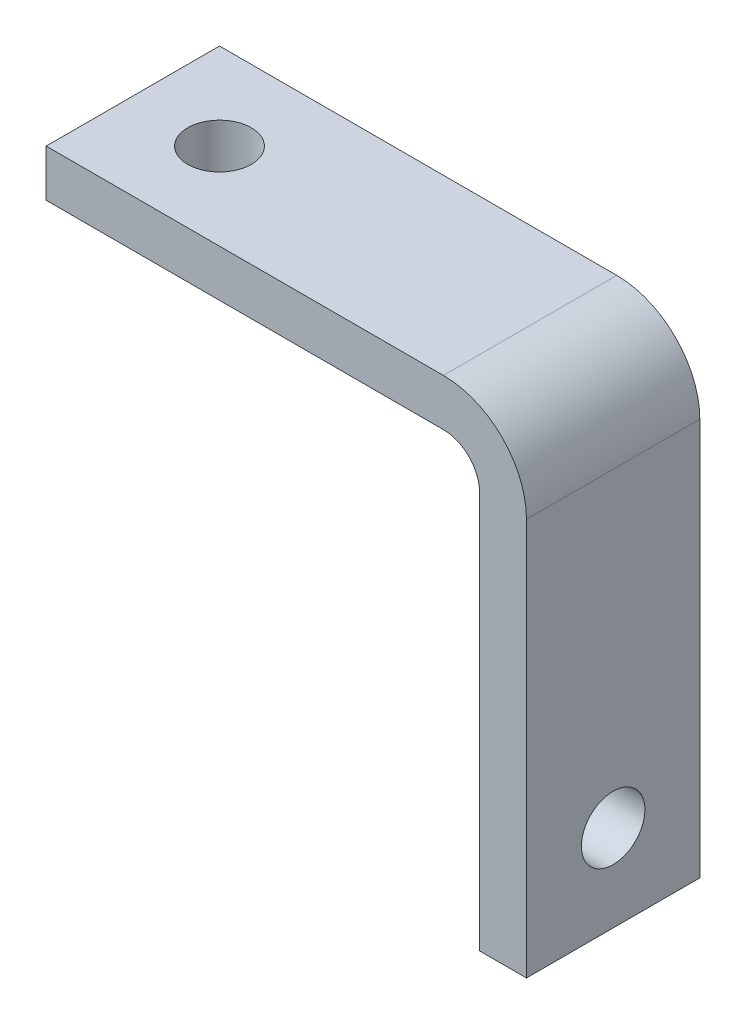
ISO-10303-21;
HEADER;
FILE_DESCRIPTION(('STEP AP214'),'2;1');
FILE_NAME('part.step','',(''),(''),'','','');
FILE_SCHEMA(('AUTOMOTIVE_DESIGN { 1 0 10303 214 1 1 1 1 }'));
ENDSEC;
DATA;
#1=APPLICATION_CONTEXT('core data for automotive mechanical design processes');
#2=APPLICATION_PROTOCOL_DEFINITION('international standard','automotive_design',2000,#1);
#3=PRODUCT_CONTEXT('',#1,'mechanical');
#4=PRODUCT('Part','Part','',(#3));
#5=PRODUCT_RELATED_PRODUCT_CATEGORY('part','',(#4));
#6=PRODUCT_DEFINITION_FORMATION('','',#4);
#7=PRODUCT_DEFINITION_CONTEXT('part definition',#1,'design');
#8=PRODUCT_DEFINITION('design','',#6,#7);
#9=PRODUCT_DEFINITION_SHAPE('','',#8);
#10=(LENGTH_UNIT() NAMED_UNIT(*) SI_UNIT(.MILLI.,.METRE.));
#11=(NAMED_UNIT(*) PLANE_ANGLE_UNIT() SI_UNIT($,.RADIAN.));
#12=(NAMED_UNIT(*) SI_UNIT($,.STERADIAN.) SOLID_ANGLE_UNIT());
#13=UNCERTAINTY_MEASURE_WITH_UNIT(LENGTH_MEASURE(1.E-05),#10,'distance_accuracy_value','');
#14=(GEOMETRIC_REPRESENTATION_CONTEXT(3) GLOBAL_UNCERTAINTY_ASSIGNED_CONTEXT((#13)) GLOBAL_UNIT_ASSIGNED_CONTEXT((#10,
#11,#12)) REPRESENTATION_CONTEXT('',''));
#15=CARTESIAN_POINT('',(0.,0.,0.));
#16=DIRECTION('',(0.,0.,1.));
#17=DIRECTION('',(1.,0.,0.));
#18=AXIS2_PLACEMENT_3D('',#15,#16,#17);
#19=CARTESIAN_POINT('',(0.,0.,0.));
#20=DIRECTION('',(0.,1.,0.));
#21=DIRECTION('',(0.,0.,1.));
#22=AXIS2_PLACEMENT_3D('',#19,#20,#21);
#23=PLANE('',#22);
#24=CARTESIAN_POINT('',(-27.25,0.,-6.));
#25=DIRECTION('',(0.,1.,0.));
#26=DIRECTION('',(0.,0.,1.));
#27=AXIS2_PLACEMENT_3D('',#24,#25,#26);
#28=CIRCLE('',#27,2.2);
#29=CARTESIAN_POINT('',(-27.25,0.,-3.8));
#30=VERTEX_POINT('',#29);
#31=EDGE_CURVE('E145',#30,#30,#28,.T.);
#32=ORIENTED_EDGE('',*,*,#31,.T.);
#33=EDGE_LOOP('',(#32));
#34=FACE_BOUND('',#33,.T.);
#35=DIRECTION('',(-1.,0.,0.));
#36=VECTOR('',#35,1.);
#37=CARTESIAN_POINT('',(0.,0.,-12.));
#38=LINE('',#37,#36);
#39=CARTESIAN_POINT('',(-5.75,0.,-12.));
#40=VERTEX_POINT('',#39);
#41=CARTESIAN_POINT('',(-33.25,0.,-12.));
#42=VERTEX_POINT('',#41);
#43=EDGE_CURVE('E143',#40,#42,#38,.T.);
#44=ORIENTED_EDGE('',*,*,#43,.F.);
#45=DIRECTION('',(0.,0.,-1.));
#46=VECTOR('',#45,1.);
#47=CARTESIAN_POINT('',(-5.75,0.,0.));
#48=LINE('',#47,#46);
#49=CARTESIAN_POINT('',(-5.75,0.,0.));
#50=VERTEX_POINT('',#49);
#51=EDGE_CURVE('E58',#40,#50,#48,.F.);
#52=ORIENTED_EDGE('',*,*,#51,.T.);
#53=DIRECTION('',(1.,0.,0.));
#54=VECTOR('',#53,1.);
#55=CARTESIAN_POINT('',(0.,0.,0.));
#56=LINE('',#55,#54);
#57=CARTESIAN_POINT('',(-33.25,0.,0.));
#58=VERTEX_POINT('',#57);
#59=EDGE_CURVE('E212',#58,#50,#56,.T.);
#60=ORIENTED_EDGE('',*,*,#59,.F.);
#61=DIRECTION('',(0.,0.,1.));
#62=VECTOR('',#61,1.);
#63=CARTESIAN_POINT('',(-33.25,0.,0.));
#64=LINE('',#63,#62);
#65=EDGE_CURVE('E214',#42,#58,#64,.T.);
#66=ORIENTED_EDGE('',*,*,#65,.F.);
#67=EDGE_LOOP('',(#44,#52,#60,#66));
#68=FACE_BOUND('',#67,.T.);
#69=ADVANCED_FACE('F39',(#34,#68),#23,.F.);
#70=CARTESIAN_POINT('',(0.,3.25,0.));
#71=DIRECTION('',(-1.,0.,0.));
#72=DIRECTION('',(0.,0.,1.));
#73=AXIS2_PLACEMENT_3D('',#70,#71,#72);
#74=PLANE('',#73);
#75=CARTESIAN_POINT('',(0.,-24.,-6.));
#76=DIRECTION('',(1.,0.,0.));
#77=DIRECTION('',(0.,0.,-1.));
#78=AXIS2_PLACEMENT_3D('',#75,#76,#77);
#79=CIRCLE('',#78,2.2);
#80=CARTESIAN_POINT('',(0.,-24.,-8.2));
#81=VERTEX_POINT('',#80);
#82=EDGE_CURVE('E135',#81,#81,#79,.T.);
#83=ORIENTED_EDGE('',*,*,#82,.F.);
#84=EDGE_LOOP('',(#83));
#85=FACE_BOUND('',#84,.T.);
#86=DIRECTION('',(0.,-1.,0.));
#87=VECTOR('',#86,1.);
#88=CARTESIAN_POINT('',(0.,3.25,-12.));
#89=LINE('',#88,#87);
#90=CARTESIAN_POINT('',(0.,-2.5,-12.));
#91=VERTEX_POINT('',#90);
#92=CARTESIAN_POINT('',(0.,-30.,-12.));
#93=VERTEX_POINT('',#92);
#94=EDGE_CURVE('E188',#91,#93,#89,.T.);
#95=ORIENTED_EDGE('',*,*,#94,.F.);
#96=DIRECTION('',(0.,0.,-1.));
#97=VECTOR('',#96,1.);
#98=CARTESIAN_POINT('',(0.,-2.5,0.));
#99=LINE('',#98,#97);
#100=CARTESIAN_POINT('',(0.,-2.5,0.));
#101=VERTEX_POINT('',#100);
#102=EDGE_CURVE('E109',#91,#101,#99,.F.);
#103=ORIENTED_EDGE('',*,*,#102,.T.);
#104=DIRECTION('',(0.,-1.,0.));
#105=VECTOR('',#104,1.);
#106=CARTESIAN_POINT('',(0.,3.25,0.));
#107=LINE('',#106,#105);
#108=CARTESIAN_POINT('',(0.,-30.,0.));
#109=VERTEX_POINT('',#108);
#110=EDGE_CURVE('E101',#101,#109,#107,.T.);
#111=ORIENTED_EDGE('',*,*,#110,.T.);
#112=DIRECTION('',(0.,0.,1.));
#113=VECTOR('',#112,1.);
#114=CARTESIAN_POINT('',(0.,-30.,0.));
#115=LINE('',#114,#113);
#116=EDGE_CURVE('E108',#93,#109,#115,.T.);
#117=ORIENTED_EDGE('',*,*,#116,.F.);
#118=EDGE_LOOP('',(#95,#103,#111,#117));
#119=FACE_BOUND('',#118,.T.);
#120=ADVANCED_FACE('F106',(#85,#119),#74,.F.);
#121=CARTESIAN_POINT('',(0.,3.25,-12.));
#122=DIRECTION('',(0.,0.,1.));
#123=DIRECTION('',(1.,0.,0.));
#124=AXIS2_PLACEMENT_3D('',#121,#122,#123);
#125=PLANE('',#124);
#126=DIRECTION('',(-1.,0.,0.));
#127=VECTOR('',#126,1.);
#128=CARTESIAN_POINT('',(0.,3.25,-12.));
#129=LINE('',#128,#127);
#130=CARTESIAN_POINT('',(-5.75,3.25,-12.));
#131=VERTEX_POINT('',#130);
#132=CARTESIAN_POINT('',(-33.25,3.25,-12.));
#133=VERTEX_POINT('',#132);
#134=EDGE_CURVE('E153',#131,#133,#129,.T.);
#135=ORIENTED_EDGE('',*,*,#134,.F.);
#136=CARTESIAN_POINT('',(-5.75,-2.5,-12.));
#137=DIRECTION('',(0.,0.,1.));
#138=DIRECTION('',(1.,0.,0.));
#139=AXIS2_PLACEMENT_3D('',#136,#137,#138);
#140=CIRCLE('',#139,5.75);
#141=EDGE_CURVE('E186',#131,#91,#140,.F.);
#142=ORIENTED_EDGE('',*,*,#141,.T.);
#143=ORIENTED_EDGE('',*,*,#94,.T.);
#144=DIRECTION('',(1.,0.,0.));
#145=VECTOR('',#144,1.);
#146=CARTESIAN_POINT('',(0.,-30.,-12.));
#147=LINE('',#146,#145);
#148=CARTESIAN_POINT('',(-3.25,-30.,-12.));
#149=VERTEX_POINT('',#148);
#150=EDGE_CURVE('E129',#149,#93,#147,.T.);
#151=ORIENTED_EDGE('',*,*,#150,.F.);
#152=DIRECTION('',(0.,1.,0.));
#153=VECTOR('',#152,1.);
#154=CARTESIAN_POINT('',(-3.25,-30.,-12.));
#155=LINE('',#154,#153);
#156=CARTESIAN_POINT('',(-3.25,-2.5,-12.));
#157=VERTEX_POINT('',#156);
#158=EDGE_CURVE('E139',#149,#157,#155,.T.);
#159=ORIENTED_EDGE('',*,*,#158,.T.);
#160=CARTESIAN_POINT('',(-5.75,-2.5,-12.));
#161=DIRECTION('',(0.,0.,1.));
#162=DIRECTION('',(1.,0.,0.));
#163=AXIS2_PLACEMENT_3D('',#160,#161,#162);
#164=CIRCLE('',#163,2.5);
#165=EDGE_CURVE('E50',#157,#40,#164,.T.);
#166=ORIENTED_EDGE('',*,*,#165,.T.);
#167=ORIENTED_EDGE('',*,*,#43,.T.);
#168=DIRECTION('',(0.,-1.,0.));
#169=VECTOR('',#168,1.);
#170=CARTESIAN_POINT('',(-33.25,3.25,-12.));
#171=LINE('',#170,#169);
#172=EDGE_CURVE('E203',#133,#42,#171,.T.);
#173=ORIENTED_EDGE('',*,*,#172,.F.);
#174=EDGE_LOOP('',(#135,#142,#143,#151,#159,#166,#167,#173));
#175=FACE_BOUND('',#174,.T.);
#176=ADVANCED_FACE('F201',(#175),#125,.F.);
#177=CARTESIAN_POINT('',(-33.25,3.25,0.));
#178=DIRECTION('',(1.,0.,0.));
#179=DIRECTION('',(0.,0.,-1.));
#180=AXIS2_PLACEMENT_3D('',#177,#178,#179);
#181=PLANE('',#180);
#182=ORIENTED_EDGE('',*,*,#65,.T.);
#183=DIRECTION('',(0.,-1.,0.));
#184=VECTOR('',#183,1.);
#185=CARTESIAN_POINT('',(-33.25,3.25,0.));
#186=LINE('',#185,#184);
#187=CARTESIAN_POINT('',(-33.25,3.25,0.));
#188=VERTEX_POINT('',#187);
#189=EDGE_CURVE('E113',#188,#58,#186,.T.);
#190=ORIENTED_EDGE('',*,*,#189,.F.);
#191=DIRECTION('',(0.,0.,1.));
#192=VECTOR('',#191,1.);
#193=CARTESIAN_POINT('',(-33.25,3.25,0.));
#194=LINE('',#193,#192);
#195=EDGE_CURVE('E220',#133,#188,#194,.T.);
#196=ORIENTED_EDGE('',*,*,#195,.F.);
#197=ORIENTED_EDGE('',*,*,#172,.T.);
#198=EDGE_LOOP('',(#182,#190,#196,#197));
#199=FACE_BOUND('',#198,.T.);
#200=ADVANCED_FACE('F223',(#199),#181,.F.);
#201=CARTESIAN_POINT('',(0.,3.25,0.));
#202=DIRECTION('',(0.,0.,-1.));
#203=DIRECTION('',(-1.,0.,0.));
#204=AXIS2_PLACEMENT_3D('',#201,#202,#203);
#205=PLANE('',#204);
#206=ORIENTED_EDGE('',*,*,#110,.F.);
#207=CARTESIAN_POINT('',(-5.75,-2.5,0.));
#208=DIRECTION('',(0.,0.,-1.));
#209=DIRECTION('',(-1.,0.,0.));
#210=AXIS2_PLACEMENT_3D('',#207,#208,#209);
#211=CIRCLE('',#210,5.75);
#212=CARTESIAN_POINT('',(-5.75,3.25,0.));
#213=VERTEX_POINT('',#212);
#214=EDGE_CURVE('E194',#101,#213,#211,.F.);
#215=ORIENTED_EDGE('',*,*,#214,.T.);
#216=DIRECTION('',(1.,0.,0.));
#217=VECTOR('',#216,1.);
#218=CARTESIAN_POINT('',(0.,3.25,0.));
#219=LINE('',#218,#217);
#220=EDGE_CURVE('E112',#188,#213,#219,.T.);
#221=ORIENTED_EDGE('',*,*,#220,.F.);
#222=ORIENTED_EDGE('',*,*,#189,.T.);
#223=ORIENTED_EDGE('',*,*,#59,.T.);
#224=CARTESIAN_POINT('',(-5.75,-2.5,0.));
#225=DIRECTION('',(0.,0.,-1.));
#226=DIRECTION('',(-1.,0.,0.));
#227=AXIS2_PLACEMENT_3D('',#224,#225,#226);
#228=CIRCLE('',#227,2.5);
#229=CARTESIAN_POINT('',(-3.25,-2.5,0.));
#230=VERTEX_POINT('',#229);
#231=EDGE_CURVE('E11',#50,#230,#228,.T.);
#232=ORIENTED_EDGE('',*,*,#231,.T.);
#233=DIRECTION('',(0.,1.,0.));
#234=VECTOR('',#233,1.);
#235=CARTESIAN_POINT('',(-3.25,-30.,0.));
#236=LINE('',#235,#234);
#237=CARTESIAN_POINT('',(-3.25,-30.,0.));
#238=VERTEX_POINT('',#237);
#239=EDGE_CURVE('E119',#238,#230,#236,.T.);
#240=ORIENTED_EDGE('',*,*,#239,.F.);
#241=DIRECTION('',(-1.,0.,0.));
#242=VECTOR('',#241,1.);
#243=CARTESIAN_POINT('',(0.,-30.,0.));
#244=LINE('',#243,#242);
#245=EDGE_CURVE('E120',#109,#238,#244,.T.);
#246=ORIENTED_EDGE('',*,*,#245,.F.);
#247=EDGE_LOOP('',(#206,#215,#221,#222,#223,#232,#240,#246));
#248=FACE_BOUND('',#247,.T.);
#249=ADVANCED_FACE('F117',(#248),#205,.F.);
#250=CARTESIAN_POINT('',(0.,3.25,0.));
#251=DIRECTION('',(0.,1.,0.));
#252=DIRECTION('',(0.,0.,1.));
#253=AXIS2_PLACEMENT_3D('',#250,#251,#252);
#254=PLANE('',#253);
#255=CARTESIAN_POINT('',(-27.25,3.250012,-6.));
#256=DIRECTION('',(0.,1.,0.));
#257=DIRECTION('',(0.,0.,1.));
#258=AXIS2_PLACEMENT_3D('',#255,#256,#257);
#259=CIRCLE('',#258,2.2);
#260=CARTESIAN_POINT('',(-27.25,3.250012,-3.8));
#261=VERTEX_POINT('',#260);
#262=EDGE_CURVE('E142',#261,#261,#259,.T.);
#263=ORIENTED_EDGE('',*,*,#262,.F.);
#264=EDGE_LOOP('',(#263));
#265=FACE_BOUND('',#264,.T.);
#266=ORIENTED_EDGE('',*,*,#220,.T.);
#267=DIRECTION('',(0.,0.,-1.));
#268=VECTOR('',#267,1.);
#269=CARTESIAN_POINT('',(-5.75,3.25,-12.));
#270=LINE('',#269,#268);
#271=EDGE_CURVE('E187',#213,#131,#270,.T.);
#272=ORIENTED_EDGE('',*,*,#271,.T.);
#273=ORIENTED_EDGE('',*,*,#134,.T.);
#274=ORIENTED_EDGE('',*,*,#195,.T.);
#275=EDGE_LOOP('',(#266,#272,#273,#274));
#276=FACE_BOUND('',#275,.T.);
#277=ADVANCED_FACE('F170',(#265,#276),#254,.T.);
#278=CARTESIAN_POINT('',(-27.25,0.,-6.));
#279=DIRECTION('',(0.,1.,0.));
#280=DIRECTION('',(0.,0.,1.));
#281=AXIS2_PLACEMENT_3D('',#278,#279,#280);
#282=CYLINDRICAL_SURFACE('',#281,2.2);
#283=ORIENTED_EDGE('',*,*,#31,.F.);
#284=EDGE_LOOP('',(#283));
#285=FACE_BOUND('',#284,.T.);
#286=ORIENTED_EDGE('',*,*,#262,.T.);
#287=EDGE_LOOP('',(#286));
#288=FACE_BOUND('',#287,.T.);
#289=ADVANCED_FACE('F157',(#285,#288),#282,.F.);
#290=CARTESIAN_POINT('',(-3.25,-30.,0.));
#291=DIRECTION('',(1.,0.,0.));
#292=DIRECTION('',(0.,0.,-1.));
#293=AXIS2_PLACEMENT_3D('',#290,#291,#292);
#294=PLANE('',#293);
#295=CARTESIAN_POINT('',(-3.25,-24.,-6.));
#296=DIRECTION('',(1.,0.,0.));
#297=DIRECTION('',(0.,0.,-1.));
#298=AXIS2_PLACEMENT_3D('',#295,#296,#297);
#299=CIRCLE('',#298,2.2);
#300=CARTESIAN_POINT('',(-3.25,-24.,-8.2));
#301=VERTEX_POINT('',#300);
#302=EDGE_CURVE('E126',#301,#301,#299,.T.);
#303=ORIENTED_EDGE('',*,*,#302,.T.);
#304=EDGE_LOOP('',(#303));
#305=FACE_BOUND('',#304,.T.);
#306=ORIENTED_EDGE('',*,*,#239,.T.);
#307=DIRECTION('',(0.,0.,-1.));
#308=VECTOR('',#307,1.);
#309=CARTESIAN_POINT('',(-3.25,-2.5,-12.));
#310=LINE('',#309,#308);
#311=EDGE_CURVE('E193',#230,#157,#310,.T.);
#312=ORIENTED_EDGE('',*,*,#311,.T.);
#313=ORIENTED_EDGE('',*,*,#158,.F.);
#314=DIRECTION('',(0.,0.,-1.));
#315=VECTOR('',#314,1.);
#316=CARTESIAN_POINT('',(-3.25,-30.,0.));
#317=LINE('',#316,#315);
#318=EDGE_CURVE('E124',#238,#149,#317,.T.);
#319=ORIENTED_EDGE('',*,*,#318,.F.);
#320=EDGE_LOOP('',(#306,#312,#313,#319));
#321=FACE_BOUND('',#320,.T.);
#322=ADVANCED_FACE('F168',(#305,#321),#294,.F.);
#323=CARTESIAN_POINT('',(0.,-30.,0.));
#324=DIRECTION('',(0.,1.,0.));
#325=DIRECTION('',(0.,0.,1.));
#326=AXIS2_PLACEMENT_3D('',#323,#324,#325);
#327=PLANE('',#326);
#328=ORIENTED_EDGE('',*,*,#116,.T.);
#329=ORIENTED_EDGE('',*,*,#245,.T.);
#330=ORIENTED_EDGE('',*,*,#318,.T.);
#331=ORIENTED_EDGE('',*,*,#150,.T.);
#332=EDGE_LOOP('',(#328,#329,#330,#331));
#333=FACE_BOUND('',#332,.T.);
#334=ADVANCED_FACE('F127',(#333),#327,.F.);
#335=CARTESIAN_POINT('',(-33.25,-24.,-6.));
#336=DIRECTION('',(1.,0.,0.));
#337=DIRECTION('',(0.,0.,-1.));
#338=AXIS2_PLACEMENT_3D('',#335,#336,#337);
#339=CYLINDRICAL_SURFACE('',#338,2.2);
#340=ORIENTED_EDGE('',*,*,#82,.T.);
#341=EDGE_LOOP('',(#340));
#342=FACE_BOUND('',#341,.T.);
#343=ORIENTED_EDGE('',*,*,#302,.F.);
#344=EDGE_LOOP('',(#343));
#345=FACE_BOUND('',#344,.T.);
#346=ADVANCED_FACE('F229',(#342,#345),#339,.F.);
#347=CARTESIAN_POINT('',(-5.75,-2.5,0.));
#348=DIRECTION('',(0.,0.,1.));
#349=DIRECTION('',(1.,0.,0.));
#350=AXIS2_PLACEMENT_3D('',#347,#348,#349);
#351=CYLINDRICAL_SURFACE('',#350,5.75);
#352=ORIENTED_EDGE('',*,*,#214,.F.);
#353=ORIENTED_EDGE('',*,*,#102,.F.);
#354=ORIENTED_EDGE('',*,*,#141,.F.);
#355=ORIENTED_EDGE('',*,*,#271,.F.);
#356=EDGE_LOOP('',(#352,#353,#354,#355));
#357=FACE_BOUND('',#356,.T.);
#358=ADVANCED_FACE('F226',(#357),#351,.T.);
#359=CARTESIAN_POINT('',(-5.75,-2.5,0.));
#360=DIRECTION('',(0.,0.,1.));
#361=DIRECTION('',(1.,0.,0.));
#362=AXIS2_PLACEMENT_3D('',#359,#360,#361);
#363=CYLINDRICAL_SURFACE('',#362,2.5);
#364=ORIENTED_EDGE('',*,*,#231,.F.);
#365=ORIENTED_EDGE('',*,*,#51,.F.);
#366=ORIENTED_EDGE('',*,*,#165,.F.);
#367=ORIENTED_EDGE('',*,*,#311,.F.);
#368=EDGE_LOOP('',(#364,#365,#366,#367));
#369=FACE_BOUND('',#368,.T.);
#370=ADVANCED_FACE('F41',(#369),#363,.F.);
#371=CLOSED_SHELL('',(#69,#120,#176,#200,#249,#277,#289,#322,#334,#346,#358,#370));
#372=MANIFOLD_SOLID_BREP('B2',#371);
#373=ADVANCED_BREP_SHAPE_REPRESENTATION('',(#18,#372),#14);
#374=SHAPE_DEFINITION_REPRESENTATION(#9,#373);
ENDSEC;
END-ISO-10303-21;
